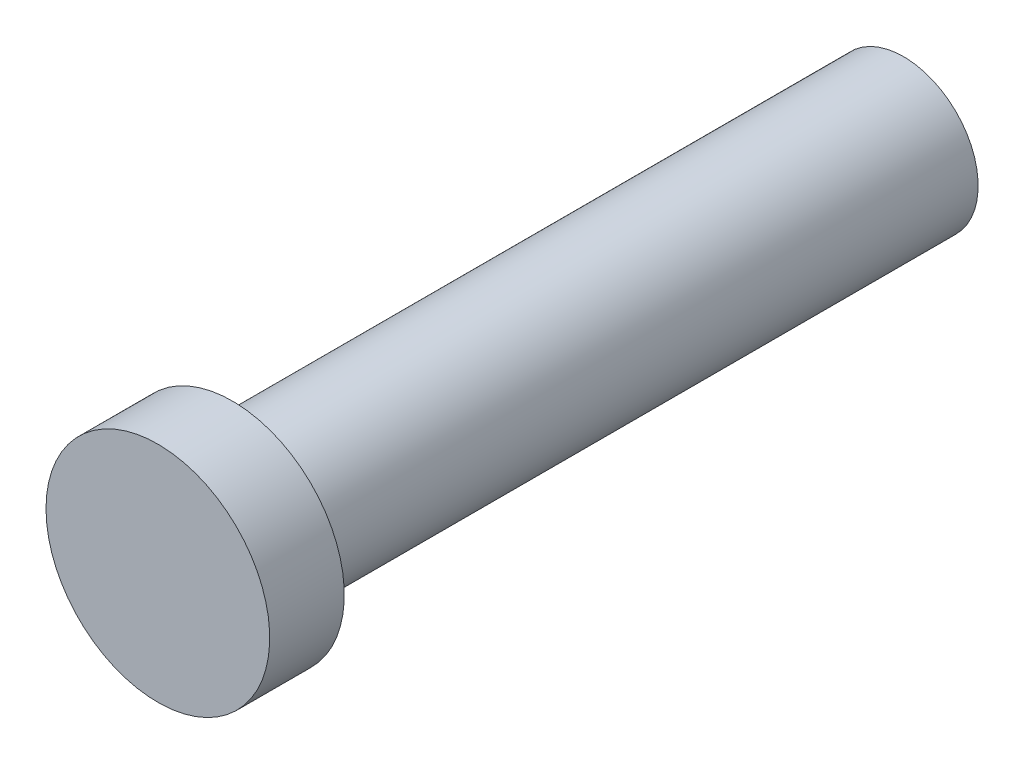
ISO-10303-21;
HEADER;
FILE_DESCRIPTION(('STEP AP214'),'2;1');
FILE_NAME('part.step','',(''),(''),'','','');
FILE_SCHEMA(('AUTOMOTIVE_DESIGN { 1 0 10303 214 1 1 1 1 }'));
ENDSEC;
DATA;
#1=APPLICATION_CONTEXT('core data for automotive mechanical design processes');
#2=APPLICATION_PROTOCOL_DEFINITION('international standard','automotive_design',2000,#1);
#3=PRODUCT_CONTEXT('',#1,'mechanical');
#4=PRODUCT('Part','Part','',(#3));
#5=PRODUCT_RELATED_PRODUCT_CATEGORY('part','',(#4));
#6=PRODUCT_DEFINITION_FORMATION('','',#4);
#7=PRODUCT_DEFINITION_CONTEXT('part definition',#1,'design');
#8=PRODUCT_DEFINITION('design','',#6,#7);
#9=PRODUCT_DEFINITION_SHAPE('','',#8);
#10=(LENGTH_UNIT() NAMED_UNIT(*) SI_UNIT(.MILLI.,.METRE.));
#11=(NAMED_UNIT(*) PLANE_ANGLE_UNIT() SI_UNIT($,.RADIAN.));
#12=(NAMED_UNIT(*) SI_UNIT($,.STERADIAN.) SOLID_ANGLE_UNIT());
#13=UNCERTAINTY_MEASURE_WITH_UNIT(LENGTH_MEASURE(1.E-05),#10,'distance_accuracy_value','');
#14=(GEOMETRIC_REPRESENTATION_CONTEXT(3) GLOBAL_UNCERTAINTY_ASSIGNED_CONTEXT((#13)) GLOBAL_UNIT_ASSIGNED_CONTEXT((#10,
#11,#12)) REPRESENTATION_CONTEXT('',''));
#15=CARTESIAN_POINT('',(0.,0.,0.));
#16=DIRECTION('',(0.,0.,1.));
#17=DIRECTION('',(1.,0.,0.));
#18=AXIS2_PLACEMENT_3D('',#15,#16,#17);
#19=CARTESIAN_POINT('',(0.,0.,45.));
#20=DIRECTION('',(0.,0.,-1.));
#21=DIRECTION('',(-1.,0.,0.));
#22=AXIS2_PLACEMENT_3D('',#19,#20,#21);
#23=CYLINDRICAL_SURFACE('',#22,5.);
#24=CARTESIAN_POINT('',(0.,0.,45.));
#25=DIRECTION('',(0.,0.,1.));
#26=DIRECTION('',(1.,0.,0.));
#27=AXIS2_PLACEMENT_3D('',#24,#25,#26);
#28=CIRCLE('',#27,5.);
#29=CARTESIAN_POINT('',(-5.,0.,45.));
#30=VERTEX_POINT('',#29);
#31=EDGE_CURVE('E10',#30,#30,#28,.T.);
#32=CARTESIAN_POINT('',(0.,0.,0.));
#33=DIRECTION('',(0.,0.,1.));
#34=DIRECTION('',(1.,0.,0.));
#35=AXIS2_PLACEMENT_3D('',#32,#33,#34);
#36=CIRCLE('',#35,5.);
#37=CARTESIAN_POINT('',(-5.,0.,0.));
#38=VERTEX_POINT('',#37);
#39=EDGE_CURVE('E40',#38,#38,#36,.T.);
#40=CARTESIAN_POINT('',(-5.,0.,45.));
#41=CARTESIAN_POINT('',(-5.,0.,44.53125));
#42=CARTESIAN_POINT('',(-5.,0.,44.0625));
#43=CARTESIAN_POINT('',(-5.,0.,43.125));
#44=CARTESIAN_POINT('',(-5.,0.,42.65625));
#45=CARTESIAN_POINT('',(-5.,0.,41.71875));
#46=CARTESIAN_POINT('',(-5.,0.,41.25));
#47=CARTESIAN_POINT('',(-5.,0.,40.3125));
#48=CARTESIAN_POINT('',(-5.,0.,39.84375));
#49=CARTESIAN_POINT('',(-5.,0.,38.90625));
#50=CARTESIAN_POINT('',(-5.,0.,38.4375));
#51=CARTESIAN_POINT('',(-5.,0.,37.5));
#52=CARTESIAN_POINT('',(-5.,0.,37.03125));
#53=CARTESIAN_POINT('',(-5.,0.,36.09375));
#54=CARTESIAN_POINT('',(-5.,0.,35.625));
#55=CARTESIAN_POINT('',(-5.,0.,34.6875));
#56=CARTESIAN_POINT('',(-5.,0.,34.21875));
#57=CARTESIAN_POINT('',(-5.,0.,33.28125));
#58=CARTESIAN_POINT('',(-5.,0.,32.8125));
#59=CARTESIAN_POINT('',(-5.,0.,31.875));
#60=CARTESIAN_POINT('',(-5.,0.,31.40625));
#61=CARTESIAN_POINT('',(-5.,0.,30.46875));
#62=CARTESIAN_POINT('',(-5.,0.,30.));
#63=CARTESIAN_POINT('',(-5.,0.,29.0625));
#64=CARTESIAN_POINT('',(-5.,0.,28.59375));
#65=CARTESIAN_POINT('',(-5.,0.,27.65625));
#66=CARTESIAN_POINT('',(-5.,0.,27.1875));
#67=CARTESIAN_POINT('',(-5.,0.,26.25));
#68=CARTESIAN_POINT('',(-5.,0.,25.78125));
#69=CARTESIAN_POINT('',(-5.,0.,24.84375));
#70=CARTESIAN_POINT('',(-5.,0.,24.375));
#71=CARTESIAN_POINT('',(-5.,0.,23.4375));
#72=CARTESIAN_POINT('',(-5.,0.,22.96875));
#73=CARTESIAN_POINT('',(-5.,0.,22.03125));
#74=CARTESIAN_POINT('',(-5.,0.,21.5625));
#75=CARTESIAN_POINT('',(-5.,0.,20.625));
#76=CARTESIAN_POINT('',(-5.,0.,20.15625));
#77=CARTESIAN_POINT('',(-5.,0.,19.21875));
#78=CARTESIAN_POINT('',(-5.,0.,18.75));
#79=CARTESIAN_POINT('',(-5.,0.,17.8125));
#80=CARTESIAN_POINT('',(-5.,0.,17.34375));
#81=CARTESIAN_POINT('',(-5.,0.,16.40625));
#82=CARTESIAN_POINT('',(-5.,0.,15.9375));
#83=CARTESIAN_POINT('',(-5.,0.,15.));
#84=CARTESIAN_POINT('',(-5.,0.,14.53125));
#85=CARTESIAN_POINT('',(-5.,0.,13.59375));
#86=CARTESIAN_POINT('',(-5.,0.,13.125));
#87=CARTESIAN_POINT('',(-5.,0.,12.1875));
#88=CARTESIAN_POINT('',(-5.,0.,11.71875));
#89=CARTESIAN_POINT('',(-5.,0.,10.78125));
#90=CARTESIAN_POINT('',(-5.,0.,10.3125));
#91=CARTESIAN_POINT('',(-5.,0.,9.375));
#92=CARTESIAN_POINT('',(-5.,0.,8.90625));
#93=CARTESIAN_POINT('',(-5.,0.,7.96874999999999));
#94=CARTESIAN_POINT('',(-5.,0.,7.5));
#95=CARTESIAN_POINT('',(-5.,0.,6.5625));
#96=CARTESIAN_POINT('',(-5.,0.,6.09375));
#97=CARTESIAN_POINT('',(-5.,0.,5.15625));
#98=CARTESIAN_POINT('',(-5.,0.,4.68749999999999));
#99=CARTESIAN_POINT('',(-5.,0.,3.74999999999999));
#100=CARTESIAN_POINT('',(-5.,0.,3.28124999999999));
#101=CARTESIAN_POINT('',(-5.,0.,2.34374999999999));
#102=CARTESIAN_POINT('',(-5.,0.,1.87499999999999));
#103=CARTESIAN_POINT('',(-5.,0.,0.937499999999992));
#104=CARTESIAN_POINT('',(-5.,0.,0.468749999999993));
#105=CARTESIAN_POINT('',(-5.,0.,0.));
#106=B_SPLINE_CURVE_WITH_KNOTS('',3,(#40,#41,#42,#43,#44,#45,#46,#47,#48,#49,#50,#51,#52,#53,
#54,#55,#56,#57,#58,#59,#60,#61,#62,#63,#64,#65,#66,#67,#68,#69,#70,#71,#72,#73,#74,#75,#76,#77,
#78,#79,#80,#81,#82,#83,#84,#85,#86,#87,#88,#89,#90,#91,#92,#93,#94,#95,#96,#97,#98,#99,#100,
#101,#102,#103,#104,#105),.UNSPECIFIED.,.F.,.F.,(4,2,2,2,2,2,2,2,2,2,2,2,2,2,2,2,2,2,2,2,2,2,2,
2,2,2,2,2,2,2,2,2,4),(0.,1.40625,2.8125,4.21875000000001,5.62500000000001,7.03125,8.4375,
9.84375000000001,11.25,12.65625,14.0625,15.46875,16.875,18.28125,19.6875,21.09375,22.5,23.90625,
25.3125,26.71875,28.125,29.53125,30.9375,32.34375,33.75,35.15625,36.5625,37.96875,39.375,
40.78125,42.1875,43.59375,45.),.UNSPECIFIED.);
#107=EDGE_CURVE('BSEAM37',#30,#38,#106,.T.);
#108=ORIENTED_EDGE('',*,*,#31,.F.);
#109=ORIENTED_EDGE('',*,*,#39,.T.);
#110=ORIENTED_EDGE('',*,*,#107,.T.);
#111=ORIENTED_EDGE('',*,*,#107,.F.);
#112=EDGE_LOOP('',(#108,#110,#109,#111));
#113=FACE_BOUND('',#112,.T.);
#114=ADVANCED_FACE('F37',(#113),#23,.T.);
#115=CARTESIAN_POINT('',(0.,0.,0.));
#116=DIRECTION('',(0.,0.,1.));
#117=DIRECTION('',(1.,0.,0.));
#118=AXIS2_PLACEMENT_3D('',#115,#116,#117);
#119=PLANE('',#118);
#120=ORIENTED_EDGE('',*,*,#39,.F.);
#121=EDGE_LOOP('',(#120));
#122=FACE_BOUND('',#121,.T.);
#123=ADVANCED_FACE('F60',(#122),#119,.F.);
#124=CARTESIAN_POINT('',(0.,0.,50.));
#125=DIRECTION('',(0.,0.,-1.));
#126=DIRECTION('',(-1.,0.,0.));
#127=AXIS2_PLACEMENT_3D('',#124,#125,#126);
#128=CYLINDRICAL_SURFACE('',#127,7.5);
#129=CARTESIAN_POINT('',(0.,0.,50.));
#130=DIRECTION('',(0.,0.,1.));
#131=DIRECTION('',(1.,0.,0.));
#132=AXIS2_PLACEMENT_3D('',#129,#130,#131);
#133=CIRCLE('',#132,7.5);
#134=CARTESIAN_POINT('',(-7.5,0.,50.));
#135=VERTEX_POINT('',#134);
#136=EDGE_CURVE('E47',#135,#135,#133,.T.);
#137=CARTESIAN_POINT('',(0.,0.,45.));
#138=DIRECTION('',(0.,0.,1.));
#139=DIRECTION('',(1.,0.,0.));
#140=AXIS2_PLACEMENT_3D('',#137,#138,#139);
#141=CIRCLE('',#140,7.5);
#142=CARTESIAN_POINT('',(-7.5,0.,45.));
#143=VERTEX_POINT('',#142);
#144=EDGE_CURVE('E49',#143,#143,#141,.T.);
#145=CARTESIAN_POINT('',(-7.5,0.,50.));
#146=CARTESIAN_POINT('',(-7.5,0.,49.9479166666667));
#147=CARTESIAN_POINT('',(-7.5,0.,49.8958333333333));
#148=CARTESIAN_POINT('',(-7.5,0.,49.7916666666667));
#149=CARTESIAN_POINT('',(-7.5,0.,49.7395833333333));
#150=CARTESIAN_POINT('',(-7.5,0.,49.6354166666667));
#151=CARTESIAN_POINT('',(-7.5,0.,49.5833333333333));
#152=CARTESIAN_POINT('',(-7.5,0.,49.4791666666667));
#153=CARTESIAN_POINT('',(-7.5,0.,49.4270833333333));
#154=CARTESIAN_POINT('',(-7.5,0.,49.3229166666667));
#155=CARTESIAN_POINT('',(-7.5,0.,49.2708333333333));
#156=CARTESIAN_POINT('',(-7.5,0.,49.1666666666667));
#157=CARTESIAN_POINT('',(-7.5,0.,49.1145833333333));
#158=CARTESIAN_POINT('',(-7.5,0.,49.0104166666667));
#159=CARTESIAN_POINT('',(-7.5,0.,48.9583333333333));
#160=CARTESIAN_POINT('',(-7.5,0.,48.8541666666667));
#161=CARTESIAN_POINT('',(-7.5,0.,48.8020833333333));
#162=CARTESIAN_POINT('',(-7.5,0.,48.6979166666667));
#163=CARTESIAN_POINT('',(-7.5,0.,48.6458333333333));
#164=CARTESIAN_POINT('',(-7.5,0.,48.5416666666667));
#165=CARTESIAN_POINT('',(-7.5,0.,48.4895833333333));
#166=CARTESIAN_POINT('',(-7.5,0.,48.3854166666667));
#167=CARTESIAN_POINT('',(-7.5,0.,48.3333333333333));
#168=CARTESIAN_POINT('',(-7.5,0.,48.2291666666667));
#169=CARTESIAN_POINT('',(-7.5,0.,48.1770833333333));
#170=CARTESIAN_POINT('',(-7.5,0.,48.0729166666667));
#171=CARTESIAN_POINT('',(-7.5,0.,48.0208333333333));
#172=CARTESIAN_POINT('',(-7.5,0.,47.9166666666667));
#173=CARTESIAN_POINT('',(-7.5,0.,47.8645833333333));
#174=CARTESIAN_POINT('',(-7.5,0.,47.7604166666667));
#175=CARTESIAN_POINT('',(-7.5,0.,47.7083333333333));
#176=CARTESIAN_POINT('',(-7.5,0.,47.6041666666667));
#177=CARTESIAN_POINT('',(-7.5,0.,47.5520833333333));
#178=CARTESIAN_POINT('',(-7.5,0.,47.4479166666667));
#179=CARTESIAN_POINT('',(-7.5,0.,47.3958333333333));
#180=CARTESIAN_POINT('',(-7.5,0.,47.2916666666667));
#181=CARTESIAN_POINT('',(-7.5,0.,47.2395833333333));
#182=CARTESIAN_POINT('',(-7.5,0.,47.1354166666667));
#183=CARTESIAN_POINT('',(-7.5,0.,47.0833333333333));
#184=CARTESIAN_POINT('',(-7.5,0.,46.9791666666667));
#185=CARTESIAN_POINT('',(-7.5,0.,46.9270833333333));
#186=CARTESIAN_POINT('',(-7.5,0.,46.8229166666667));
#187=CARTESIAN_POINT('',(-7.5,0.,46.7708333333333));
#188=CARTESIAN_POINT('',(-7.5,0.,46.6666666666667));
#189=CARTESIAN_POINT('',(-7.5,0.,46.6145833333333));
#190=CARTESIAN_POINT('',(-7.5,0.,46.5104166666667));
#191=CARTESIAN_POINT('',(-7.5,0.,46.4583333333333));
#192=CARTESIAN_POINT('',(-7.5,0.,46.3541666666667));
#193=CARTESIAN_POINT('',(-7.5,0.,46.3020833333333));
#194=CARTESIAN_POINT('',(-7.5,0.,46.1979166666667));
#195=CARTESIAN_POINT('',(-7.5,0.,46.1458333333333));
#196=CARTESIAN_POINT('',(-7.5,0.,46.0416666666667));
#197=CARTESIAN_POINT('',(-7.5,0.,45.9895833333333));
#198=CARTESIAN_POINT('',(-7.5,0.,45.8854166666667));
#199=CARTESIAN_POINT('',(-7.5,0.,45.8333333333333));
#200=CARTESIAN_POINT('',(-7.5,0.,45.7291666666667));
#201=CARTESIAN_POINT('',(-7.5,0.,45.6770833333333));
#202=CARTESIAN_POINT('',(-7.5,0.,45.5729166666667));
#203=CARTESIAN_POINT('',(-7.5,0.,45.5208333333333));
#204=CARTESIAN_POINT('',(-7.5,0.,45.4166666666667));
#205=CARTESIAN_POINT('',(-7.5,0.,45.3645833333333));
#206=CARTESIAN_POINT('',(-7.5,0.,45.2604166666667));
#207=CARTESIAN_POINT('',(-7.5,0.,45.2083333333333));
#208=CARTESIAN_POINT('',(-7.5,0.,45.1041666666667));
#209=CARTESIAN_POINT('',(-7.5,0.,45.0520833333333));
#210=CARTESIAN_POINT('',(-7.5,0.,45.));
#211=B_SPLINE_CURVE_WITH_KNOTS('',3,(#145,#146,#147,#148,#149,#150,#151,#152,#153,#154,#155,
#156,#157,#158,#159,#160,#161,#162,#163,#164,#165,#166,#167,#168,#169,#170,#171,#172,#173,#174,
#175,#176,#177,#178,#179,#180,#181,#182,#183,#184,#185,#186,#187,#188,#189,#190,#191,#192,#193,
#194,#195,#196,#197,#198,#199,#200,#201,#202,#203,#204,#205,#206,#207,#208,#209,#210),
.UNSPECIFIED.,.F.,.F.,(4,2,2,2,2,2,2,2,2,2,2,2,2,2,2,2,2,2,2,2,2,2,2,2,2,2,2,2,2,2,2,2,4),(0.,
0.156250000000004,0.3125,0.468750000000004,0.625000000000001,0.781250000000004,
0.937500000000001,1.09375,1.25,1.40625,1.5625,1.71875,1.875,2.03125,2.1875,2.34375,2.5,2.65625,
2.8125,2.96875,3.125,3.28125,3.4375,3.59375,3.75,3.90625,4.0625,4.21874999999999,4.375,
4.53124999999999,4.6875,4.84374999999999,5.),.UNSPECIFIED.);
#212=EDGE_CURVE('BSEAM57',#135,#143,#211,.T.);
#213=ORIENTED_EDGE('',*,*,#136,.F.);
#214=ORIENTED_EDGE('',*,*,#144,.T.);
#215=ORIENTED_EDGE('',*,*,#212,.T.);
#216=ORIENTED_EDGE('',*,*,#212,.F.);
#217=EDGE_LOOP('',(#213,#215,#214,#216));
#218=FACE_BOUND('',#217,.T.);
#219=ADVANCED_FACE('F57',(#218),#128,.T.);
#220=CARTESIAN_POINT('',(0.,0.,50.));
#221=DIRECTION('',(0.,0.,1.));
#222=DIRECTION('',(1.,0.,0.));
#223=AXIS2_PLACEMENT_3D('',#220,#221,#222);
#224=PLANE('',#223);
#225=ORIENTED_EDGE('',*,*,#136,.T.);
#226=EDGE_LOOP('',(#225));
#227=FACE_BOUND('',#226,.T.);
#228=ADVANCED_FACE('F55',(#227),#224,.T.);
#229=CARTESIAN_POINT('',(0.,0.,45.));
#230=DIRECTION('',(0.,0.,1.));
#231=DIRECTION('',(1.,0.,0.));
#232=AXIS2_PLACEMENT_3D('',#229,#230,#231);
#233=PLANE('',#232);
#234=ORIENTED_EDGE('',*,*,#31,.T.);
#235=EDGE_LOOP('',(#234));
#236=FACE_BOUND('',#235,.T.);
#237=ORIENTED_EDGE('',*,*,#144,.F.);
#238=EDGE_LOOP('',(#237));
#239=FACE_BOUND('',#238,.T.);
#240=ADVANCED_FACE('F64',(#236,#239),#233,.F.);
#241=CLOSED_SHELL('',(#114,#123,#219,#228,#240));
#242=MANIFOLD_SOLID_BREP('B2',#241);
#243=ADVANCED_BREP_SHAPE_REPRESENTATION('',(#18,#242),#14);
#244=SHAPE_DEFINITION_REPRESENTATION(#9,#243);
ENDSEC;
END-ISO-10303-21;
